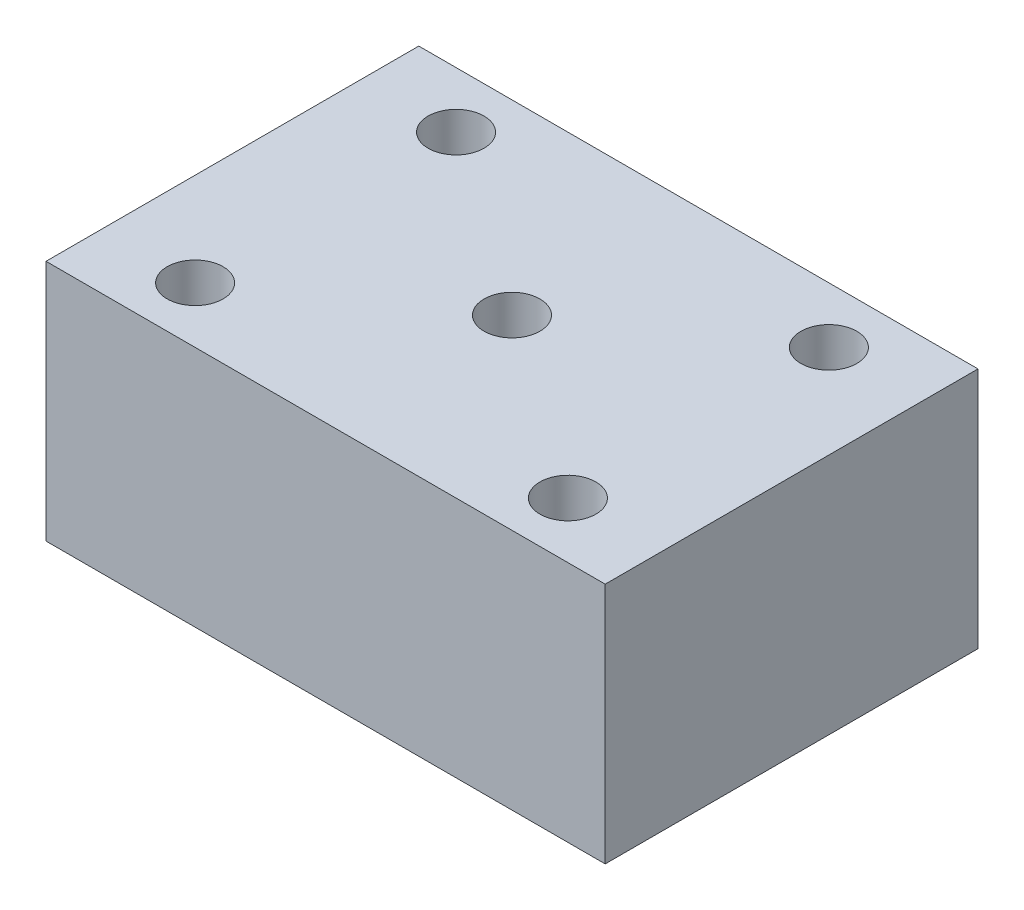
ISO-10303-21;
HEADER;
FILE_DESCRIPTION(('STEP AP214'),'2;1');
FILE_NAME('part.step','',(''),(''),'','','');
FILE_SCHEMA(('AUTOMOTIVE_DESIGN { 1 0 10303 214 1 1 1 1 }'));
ENDSEC;
DATA;
#1=APPLICATION_CONTEXT('core data for automotive mechanical design processes');
#2=APPLICATION_PROTOCOL_DEFINITION('international standard','automotive_design',2000,#1);
#3=PRODUCT_CONTEXT('',#1,'mechanical');
#4=PRODUCT('Part','Part','',(#3));
#5=PRODUCT_RELATED_PRODUCT_CATEGORY('part','',(#4));
#6=PRODUCT_DEFINITION_FORMATION('','',#4);
#7=PRODUCT_DEFINITION_CONTEXT('part definition',#1,'design');
#8=PRODUCT_DEFINITION('design','',#6,#7);
#9=PRODUCT_DEFINITION_SHAPE('','',#8);
#10=(LENGTH_UNIT() NAMED_UNIT(*) SI_UNIT(.MILLI.,.METRE.));
#11=(NAMED_UNIT(*) PLANE_ANGLE_UNIT() SI_UNIT($,.RADIAN.));
#12=(NAMED_UNIT(*) SI_UNIT($,.STERADIAN.) SOLID_ANGLE_UNIT());
#13=UNCERTAINTY_MEASURE_WITH_UNIT(LENGTH_MEASURE(1.E-05),#10,'distance_accuracy_value','');
#14=(GEOMETRIC_REPRESENTATION_CONTEXT(3) GLOBAL_UNCERTAINTY_ASSIGNED_CONTEXT((#13)) GLOBAL_UNIT_ASSIGNED_CONTEXT((#10,
#11,#12)) REPRESENTATION_CONTEXT('',''));
#15=CARTESIAN_POINT('',(0.,0.,0.));
#16=DIRECTION('',(0.,0.,1.));
#17=DIRECTION('',(1.,0.,0.));
#18=AXIS2_PLACEMENT_3D('',#15,#16,#17);
#19=CARTESIAN_POINT('',(0.,13.,0.));
#20=DIRECTION('',(0.,1.,0.));
#21=DIRECTION('',(0.,0.,1.));
#22=AXIS2_PLACEMENT_3D('',#19,#20,#21);
#23=PLANE('',#22);
#24=CARTESIAN_POINT('',(-10.,13.,-7.));
#25=DIRECTION('',(0.,1.,0.));
#26=DIRECTION('',(0.,0.,-1.));
#27=AXIS2_PLACEMENT_3D('',#24,#25,#26);
#28=CIRCLE('',#27,1.5);
#29=CARTESIAN_POINT('',(-10.,13.,-8.5));
#30=VERTEX_POINT('',#29);
#31=EDGE_CURVE('E131',#30,#30,#28,.T.);
#32=ORIENTED_EDGE('',*,*,#31,.F.);
#33=EDGE_LOOP('',(#32));
#34=FACE_BOUND('',#33,.T.);
#35=CARTESIAN_POINT('',(10.,13.,7.));
#36=DIRECTION('',(0.,1.,0.));
#37=DIRECTION('',(0.,0.,-1.));
#38=AXIS2_PLACEMENT_3D('',#35,#36,#37);
#39=CIRCLE('',#38,1.5);
#40=CARTESIAN_POINT('',(10.,13.,5.5));
#41=VERTEX_POINT('',#40);
#42=EDGE_CURVE('E119',#41,#41,#39,.T.);
#43=ORIENTED_EDGE('',*,*,#42,.F.);
#44=EDGE_LOOP('',(#43));
#45=FACE_BOUND('',#44,.T.);
#46=DIRECTION('',(0.,0.,1.));
#47=VECTOR('',#46,1.);
#48=CARTESIAN_POINT('',(-15.,13.,-10.));
#49=LINE('',#48,#47);
#50=CARTESIAN_POINT('',(-15.,13.,-10.));
#51=VERTEX_POINT('',#50);
#52=CARTESIAN_POINT('',(-15.,13.,10.));
#53=VERTEX_POINT('',#52);
#54=EDGE_CURVE('E89',#51,#53,#49,.T.);
#55=ORIENTED_EDGE('',*,*,#54,.T.);
#56=DIRECTION('',(1.,0.,0.));
#57=VECTOR('',#56,1.);
#58=CARTESIAN_POINT('',(-15.,13.,10.));
#59=LINE('',#58,#57);
#60=CARTESIAN_POINT('',(15.,13.,10.));
#61=VERTEX_POINT('',#60);
#62=EDGE_CURVE('E84',#53,#61,#59,.T.);
#63=ORIENTED_EDGE('',*,*,#62,.T.);
#64=DIRECTION('',(0.,0.,-1.));
#65=VECTOR('',#64,1.);
#66=CARTESIAN_POINT('',(15.,13.,-10.));
#67=LINE('',#66,#65);
#68=CARTESIAN_POINT('',(15.,13.,-10.));
#69=VERTEX_POINT('',#68);
#70=EDGE_CURVE('E87',#61,#69,#67,.T.);
#71=ORIENTED_EDGE('',*,*,#70,.T.);
#72=DIRECTION('',(-1.,0.,0.));
#73=VECTOR('',#72,1.);
#74=CARTESIAN_POINT('',(-15.,13.,-10.));
#75=LINE('',#74,#73);
#76=EDGE_CURVE('E54',#69,#51,#75,.T.);
#77=ORIENTED_EDGE('',*,*,#76,.T.);
#78=EDGE_LOOP('',(#55,#63,#71,#77));
#79=FACE_BOUND('',#78,.T.);
#80=CARTESIAN_POINT('',(-10.,13.,7.));
#81=DIRECTION('',(0.,1.,0.));
#82=DIRECTION('',(0.,0.,1.));
#83=AXIS2_PLACEMENT_3D('',#80,#81,#82);
#84=CIRCLE('',#83,1.5);
#85=CARTESIAN_POINT('',(-10.,13.,5.5));
#86=VERTEX_POINT('',#85);
#87=EDGE_CURVE('E104',#86,#86,#84,.T.);
#88=ORIENTED_EDGE('',*,*,#87,.F.);
#89=EDGE_LOOP('',(#88));
#90=FACE_BOUND('',#89,.T.);
#91=CARTESIAN_POINT('',(10.,13.,-7.));
#92=DIRECTION('',(0.,1.,0.));
#93=DIRECTION('',(0.,0.,1.));
#94=AXIS2_PLACEMENT_3D('',#91,#92,#93);
#95=CIRCLE('',#94,1.5);
#96=CARTESIAN_POINT('',(10.,13.,-8.5));
#97=VERTEX_POINT('',#96);
#98=EDGE_CURVE('E125',#97,#97,#95,.T.);
#99=ORIENTED_EDGE('',*,*,#98,.F.);
#100=EDGE_LOOP('',(#99));
#101=FACE_BOUND('',#100,.T.);
#102=CARTESIAN_POINT('',(0.,13.,0.));
#103=DIRECTION('',(0.,1.,0.));
#104=DIRECTION('',(0.,0.,1.));
#105=AXIS2_PLACEMENT_3D('',#102,#103,#104);
#106=CIRCLE('',#105,1.5);
#107=CARTESIAN_POINT('',(0.,13.,-1.5));
#108=VERTEX_POINT('',#107);
#109=EDGE_CURVE('E137',#108,#108,#106,.T.);
#110=ORIENTED_EDGE('',*,*,#109,.F.);
#111=EDGE_LOOP('',(#110));
#112=FACE_BOUND('',#111,.T.);
#113=ADVANCED_FACE('F37',(#34,#45,#79,#90,#101,#112),#23,.T.);
#114=CARTESIAN_POINT('',(0.,0.,0.));
#115=DIRECTION('',(0.,1.,0.));
#116=DIRECTION('',(0.,0.,1.));
#117=AXIS2_PLACEMENT_3D('',#114,#115,#116);
#118=PLANE('',#117);
#119=DIRECTION('',(0.,0.,1.));
#120=VECTOR('',#119,1.);
#121=CARTESIAN_POINT('',(-15.,0.,-10.));
#122=LINE('',#121,#120);
#123=CARTESIAN_POINT('',(-15.,0.,-10.));
#124=VERTEX_POINT('',#123);
#125=CARTESIAN_POINT('',(-15.,0.,10.));
#126=VERTEX_POINT('',#125);
#127=EDGE_CURVE('E101',#124,#126,#122,.T.);
#128=ORIENTED_EDGE('',*,*,#127,.F.);
#129=DIRECTION('',(-1.,0.,0.));
#130=VECTOR('',#129,1.);
#131=CARTESIAN_POINT('',(-15.,0.,-10.));
#132=LINE('',#131,#130);
#133=CARTESIAN_POINT('',(15.,0.,-10.));
#134=VERTEX_POINT('',#133);
#135=EDGE_CURVE('E77',#134,#124,#132,.T.);
#136=ORIENTED_EDGE('',*,*,#135,.F.);
#137=DIRECTION('',(0.,0.,-1.));
#138=VECTOR('',#137,1.);
#139=CARTESIAN_POINT('',(15.,0.,-10.));
#140=LINE('',#139,#138);
#141=CARTESIAN_POINT('',(15.,0.,10.));
#142=VERTEX_POINT('',#141);
#143=EDGE_CURVE('E71',#142,#134,#140,.T.);
#144=ORIENTED_EDGE('',*,*,#143,.F.);
#145=DIRECTION('',(1.,0.,0.));
#146=VECTOR('',#145,1.);
#147=CARTESIAN_POINT('',(-15.,0.,10.));
#148=LINE('',#147,#146);
#149=EDGE_CURVE('E93',#126,#142,#148,.T.);
#150=ORIENTED_EDGE('',*,*,#149,.F.);
#151=EDGE_LOOP('',(#128,#136,#144,#150));
#152=FACE_BOUND('',#151,.T.);
#153=CARTESIAN_POINT('',(-10.,0.,7.));
#154=DIRECTION('',(0.,1.,0.));
#155=DIRECTION('',(0.,0.,1.));
#156=AXIS2_PLACEMENT_3D('',#153,#154,#155);
#157=CIRCLE('',#156,1.5);
#158=CARTESIAN_POINT('',(-10.,0.,5.5));
#159=VERTEX_POINT('',#158);
#160=EDGE_CURVE('E116',#159,#159,#157,.T.);
#161=ORIENTED_EDGE('',*,*,#160,.T.);
#162=EDGE_LOOP('',(#161));
#163=FACE_BOUND('',#162,.T.);
#164=CARTESIAN_POINT('',(10.,0.,7.));
#165=DIRECTION('',(0.,1.,0.));
#166=DIRECTION('',(0.,0.,-1.));
#167=AXIS2_PLACEMENT_3D('',#164,#165,#166);
#168=CIRCLE('',#167,1.5);
#169=CARTESIAN_POINT('',(10.,0.,5.5));
#170=VERTEX_POINT('',#169);
#171=EDGE_CURVE('E122',#170,#170,#168,.T.);
#172=ORIENTED_EDGE('',*,*,#171,.T.);
#173=EDGE_LOOP('',(#172));
#174=FACE_BOUND('',#173,.T.);
#175=CARTESIAN_POINT('',(10.,0.,-7.));
#176=DIRECTION('',(0.,1.,0.));
#177=DIRECTION('',(0.,0.,1.));
#178=AXIS2_PLACEMENT_3D('',#175,#176,#177);
#179=CIRCLE('',#178,1.5);
#180=CARTESIAN_POINT('',(10.,0.,-8.5));
#181=VERTEX_POINT('',#180);
#182=EDGE_CURVE('E128',#181,#181,#179,.T.);
#183=ORIENTED_EDGE('',*,*,#182,.T.);
#184=EDGE_LOOP('',(#183));
#185=FACE_BOUND('',#184,.T.);
#186=CARTESIAN_POINT('',(-10.,0.,-7.));
#187=DIRECTION('',(0.,1.,0.));
#188=DIRECTION('',(0.,0.,-1.));
#189=AXIS2_PLACEMENT_3D('',#186,#187,#188);
#190=CIRCLE('',#189,1.5);
#191=CARTESIAN_POINT('',(-10.,0.,-8.5));
#192=VERTEX_POINT('',#191);
#193=EDGE_CURVE('E134',#192,#192,#190,.T.);
#194=ORIENTED_EDGE('',*,*,#193,.T.);
#195=EDGE_LOOP('',(#194));
#196=FACE_BOUND('',#195,.T.);
#197=CARTESIAN_POINT('',(0.,0.,0.));
#198=DIRECTION('',(0.,1.,0.));
#199=DIRECTION('',(0.,0.,1.));
#200=AXIS2_PLACEMENT_3D('',#197,#198,#199);
#201=CIRCLE('',#200,1.5);
#202=CARTESIAN_POINT('',(0.,0.,-1.5));
#203=VERTEX_POINT('',#202);
#204=EDGE_CURVE('E140',#203,#203,#201,.T.);
#205=ORIENTED_EDGE('',*,*,#204,.T.);
#206=EDGE_LOOP('',(#205));
#207=FACE_BOUND('',#206,.T.);
#208=ADVANCED_FACE('F112',(#152,#163,#174,#185,#196,#207),#118,.F.);
#209=CARTESIAN_POINT('',(-15.,13.,-10.));
#210=DIRECTION('',(1.,0.,0.));
#211=DIRECTION('',(0.,0.,-1.));
#212=AXIS2_PLACEMENT_3D('',#209,#210,#211);
#213=PLANE('',#212);
#214=ORIENTED_EDGE('',*,*,#127,.T.);
#215=DIRECTION('',(0.,-1.,0.));
#216=VECTOR('',#215,1.);
#217=CARTESIAN_POINT('',(-15.,13.,10.));
#218=LINE('',#217,#216);
#219=EDGE_CURVE('E11',#53,#126,#218,.T.);
#220=ORIENTED_EDGE('',*,*,#219,.F.);
#221=ORIENTED_EDGE('',*,*,#54,.F.);
#222=DIRECTION('',(0.,-1.,0.));
#223=VECTOR('',#222,1.);
#224=CARTESIAN_POINT('',(-15.,13.,-10.));
#225=LINE('',#224,#223);
#226=EDGE_CURVE('E97',#51,#124,#225,.T.);
#227=ORIENTED_EDGE('',*,*,#226,.T.);
#228=EDGE_LOOP('',(#214,#220,#221,#227));
#229=FACE_BOUND('',#228,.T.);
#230=ADVANCED_FACE('F39',(#229),#213,.F.);
#231=CARTESIAN_POINT('',(-15.,13.,10.));
#232=DIRECTION('',(0.,0.,-1.));
#233=DIRECTION('',(-1.,0.,0.));
#234=AXIS2_PLACEMENT_3D('',#231,#232,#233);
#235=PLANE('',#234);
#236=ORIENTED_EDGE('',*,*,#149,.T.);
#237=DIRECTION('',(0.,-1.,0.));
#238=VECTOR('',#237,1.);
#239=CARTESIAN_POINT('',(15.,13.,10.));
#240=LINE('',#239,#238);
#241=EDGE_CURVE('E46',#61,#142,#240,.T.);
#242=ORIENTED_EDGE('',*,*,#241,.F.);
#243=ORIENTED_EDGE('',*,*,#62,.F.);
#244=ORIENTED_EDGE('',*,*,#219,.T.);
#245=EDGE_LOOP('',(#236,#242,#243,#244));
#246=FACE_BOUND('',#245,.T.);
#247=ADVANCED_FACE('F92',(#246),#235,.F.);
#248=CARTESIAN_POINT('',(15.,13.,-10.));
#249=DIRECTION('',(-1.,0.,0.));
#250=DIRECTION('',(0.,0.,1.));
#251=AXIS2_PLACEMENT_3D('',#248,#249,#250);
#252=PLANE('',#251);
#253=ORIENTED_EDGE('',*,*,#143,.T.);
#254=DIRECTION('',(0.,-1.,0.));
#255=VECTOR('',#254,1.);
#256=CARTESIAN_POINT('',(15.,13.,-10.));
#257=LINE('',#256,#255);
#258=EDGE_CURVE('E94',#69,#134,#257,.T.);
#259=ORIENTED_EDGE('',*,*,#258,.F.);
#260=ORIENTED_EDGE('',*,*,#70,.F.);
#261=ORIENTED_EDGE('',*,*,#241,.T.);
#262=EDGE_LOOP('',(#253,#259,#260,#261));
#263=FACE_BOUND('',#262,.T.);
#264=ADVANCED_FACE('F95',(#263),#252,.F.);
#265=CARTESIAN_POINT('',(-15.,13.,-10.));
#266=DIRECTION('',(0.,0.,1.));
#267=DIRECTION('',(1.,0.,0.));
#268=AXIS2_PLACEMENT_3D('',#265,#266,#267);
#269=PLANE('',#268);
#270=ORIENTED_EDGE('',*,*,#135,.T.);
#271=ORIENTED_EDGE('',*,*,#226,.F.);
#272=ORIENTED_EDGE('',*,*,#76,.F.);
#273=ORIENTED_EDGE('',*,*,#258,.T.);
#274=EDGE_LOOP('',(#270,#271,#272,#273));
#275=FACE_BOUND('',#274,.T.);
#276=ADVANCED_FACE('F109',(#275),#269,.F.);
#277=CARTESIAN_POINT('',(-10.,13.,7.));
#278=DIRECTION('',(0.,-1.,0.));
#279=DIRECTION('',(0.,0.,-1.));
#280=AXIS2_PLACEMENT_3D('',#277,#278,#279);
#281=CYLINDRICAL_SURFACE('',#280,1.5);
#282=CARTESIAN_POINT('',(-10.,13.,5.5));
#283=CARTESIAN_POINT('',(-10.,12.8645833333333,5.5));
#284=CARTESIAN_POINT('',(-10.,12.7291666666667,5.5));
#285=CARTESIAN_POINT('',(-10.,12.4583333333333,5.5));
#286=CARTESIAN_POINT('',(-10.,12.3229166666667,5.5));
#287=CARTESIAN_POINT('',(-10.,12.0520833333333,5.5));
#288=CARTESIAN_POINT('',(-10.,11.9166666666667,5.5));
#289=CARTESIAN_POINT('',(-10.,11.6458333333333,5.5));
#290=CARTESIAN_POINT('',(-10.,11.5104166666667,5.5));
#291=CARTESIAN_POINT('',(-10.,11.2395833333333,5.5));
#292=CARTESIAN_POINT('',(-10.,11.1041666666667,5.5));
#293=CARTESIAN_POINT('',(-10.,10.8333333333333,5.5));
#294=CARTESIAN_POINT('',(-10.,10.6979166666667,5.5));
#295=CARTESIAN_POINT('',(-10.,10.4270833333333,5.5));
#296=CARTESIAN_POINT('',(-10.,10.2916666666667,5.5));
#297=CARTESIAN_POINT('',(-10.,10.0208333333333,5.5));
#298=CARTESIAN_POINT('',(-10.,9.88541666666667,5.5));
#299=CARTESIAN_POINT('',(-10.,9.61458333333333,5.5));
#300=CARTESIAN_POINT('',(-10.,9.47916666666667,5.5));
#301=CARTESIAN_POINT('',(-10.,9.20833333333333,5.5));
#302=CARTESIAN_POINT('',(-10.,9.07291666666666,5.5));
#303=CARTESIAN_POINT('',(-10.,8.80208333333333,5.5));
#304=CARTESIAN_POINT('',(-10.,8.66666666666667,5.5));
#305=CARTESIAN_POINT('',(-10.,8.39583333333333,5.5));
#306=CARTESIAN_POINT('',(-10.,8.26041666666667,5.5));
#307=CARTESIAN_POINT('',(-10.,7.98958333333333,5.5));
#308=CARTESIAN_POINT('',(-10.,7.85416666666667,5.5));
#309=CARTESIAN_POINT('',(-10.,7.58333333333333,5.5));
#310=CARTESIAN_POINT('',(-10.,7.44791666666667,5.5));
#311=CARTESIAN_POINT('',(-10.,7.17708333333333,5.5));
#312=CARTESIAN_POINT('',(-10.,7.04166666666667,5.5));
#313=CARTESIAN_POINT('',(-10.,6.77083333333333,5.5));
#314=CARTESIAN_POINT('',(-10.,6.63541666666667,5.5));
#315=CARTESIAN_POINT('',(-10.,6.36458333333333,5.5));
#316=CARTESIAN_POINT('',(-10.,6.22916666666667,5.5));
#317=CARTESIAN_POINT('',(-10.,5.95833333333333,5.5));
#318=CARTESIAN_POINT('',(-10.,5.82291666666667,5.5));
#319=CARTESIAN_POINT('',(-10.,5.55208333333333,5.5));
#320=CARTESIAN_POINT('',(-10.,5.41666666666667,5.5));
#321=CARTESIAN_POINT('',(-10.,5.14583333333333,5.5));
#322=CARTESIAN_POINT('',(-10.,5.01041666666667,5.5));
#323=CARTESIAN_POINT('',(-10.,4.73958333333333,5.5));
#324=CARTESIAN_POINT('',(-10.,4.60416666666667,5.5));
#325=CARTESIAN_POINT('',(-10.,4.33333333333333,5.5));
#326=CARTESIAN_POINT('',(-10.,4.19791666666667,5.5));
#327=CARTESIAN_POINT('',(-10.,3.92708333333333,5.5));
#328=CARTESIAN_POINT('',(-10.,3.79166666666667,5.5));
#329=CARTESIAN_POINT('',(-10.,3.52083333333333,5.5));
#330=CARTESIAN_POINT('',(-10.,3.38541666666667,5.5));
#331=CARTESIAN_POINT('',(-10.,3.11458333333333,5.5));
#332=CARTESIAN_POINT('',(-10.,2.97916666666667,5.5));
#333=CARTESIAN_POINT('',(-10.,2.70833333333333,5.5));
#334=CARTESIAN_POINT('',(-10.,2.57291666666667,5.5));
#335=CARTESIAN_POINT('',(-10.,2.30208333333333,5.5));
#336=CARTESIAN_POINT('',(-10.,2.16666666666667,5.5));
#337=CARTESIAN_POINT('',(-10.,1.89583333333333,5.5));
#338=CARTESIAN_POINT('',(-10.,1.76041666666667,5.5));
#339=CARTESIAN_POINT('',(-10.,1.48958333333333,5.5));
#340=CARTESIAN_POINT('',(-10.,1.35416666666667,5.5));
#341=CARTESIAN_POINT('',(-10.,1.08333333333333,5.5));
#342=CARTESIAN_POINT('',(-10.,0.947916666666667,5.5));
#343=CARTESIAN_POINT('',(-10.,0.677083333333334,5.5));
#344=CARTESIAN_POINT('',(-10.,0.541666666666667,5.5));
#345=CARTESIAN_POINT('',(-10.,0.270833333333334,5.5));
#346=CARTESIAN_POINT('',(-10.,0.135416666666667,5.5));
#347=CARTESIAN_POINT('',(-10.,0.,5.5));
#348=B_SPLINE_CURVE_WITH_KNOTS('',3,(#282,#283,#284,#285,#286,#287,#288,#289,#290,#291,#292,
#293,#294,#295,#296,#297,#298,#299,#300,#301,#302,#303,#304,#305,#306,#307,#308,#309,#310,#311,
#312,#313,#314,#315,#316,#317,#318,#319,#320,#321,#322,#323,#324,#325,#326,#327,#328,#329,#330,
#331,#332,#333,#334,#335,#336,#337,#338,#339,#340,#341,#342,#343,#344,#345,#346,#347),
.UNSPECIFIED.,.F.,.F.,(4,2,2,2,2,2,2,2,2,2,2,2,2,2,2,2,2,2,2,2,2,2,2,2,2,2,2,2,2,2,2,2,4),(0.,
0.40625,0.812500000000001,1.21875,1.625,2.03125,2.4375,2.84375,3.25,3.65625,4.0625,4.46875,
4.875,5.28125,5.6875,6.09375,6.5,6.90625,7.3125,7.71875,8.125,8.53125,8.9375,9.34375,9.75,
10.15625,10.5625,10.96875,11.375,11.78125,12.1875,12.59375,13.),.UNSPECIFIED.);
#349=EDGE_CURVE('BSEAM159',#86,#159,#348,.T.);
#350=ORIENTED_EDGE('',*,*,#87,.T.);
#351=ORIENTED_EDGE('',*,*,#160,.F.);
#352=ORIENTED_EDGE('',*,*,#349,.T.);
#353=ORIENTED_EDGE('',*,*,#349,.F.);
#354=EDGE_LOOP('',(#350,#352,#351,#353));
#355=FACE_BOUND('',#354,.T.);
#356=ADVANCED_FACE('F159',(#355),#281,.F.);
#357=CARTESIAN_POINT('',(10.,13.,7.));
#358=DIRECTION('',(0.,-1.,0.));
#359=DIRECTION('',(0.,0.,-1.));
#360=AXIS2_PLACEMENT_3D('',#357,#358,#359);
#361=CYLINDRICAL_SURFACE('',#360,1.5);
#362=CARTESIAN_POINT('',(10.,13.,5.5));
#363=CARTESIAN_POINT('',(10.,12.8645833333333,5.5));
#364=CARTESIAN_POINT('',(10.,12.7291666666667,5.5));
#365=CARTESIAN_POINT('',(10.,12.4583333333333,5.5));
#366=CARTESIAN_POINT('',(10.,12.3229166666667,5.5));
#367=CARTESIAN_POINT('',(10.,12.0520833333333,5.5));
#368=CARTESIAN_POINT('',(10.,11.9166666666667,5.5));
#369=CARTESIAN_POINT('',(10.,11.6458333333333,5.5));
#370=CARTESIAN_POINT('',(10.,11.5104166666667,5.5));
#371=CARTESIAN_POINT('',(10.,11.2395833333333,5.5));
#372=CARTESIAN_POINT('',(10.,11.1041666666667,5.5));
#373=CARTESIAN_POINT('',(10.,10.8333333333333,5.5));
#374=CARTESIAN_POINT('',(10.,10.6979166666667,5.5));
#375=CARTESIAN_POINT('',(10.,10.4270833333333,5.5));
#376=CARTESIAN_POINT('',(10.,10.2916666666667,5.5));
#377=CARTESIAN_POINT('',(10.,10.0208333333333,5.5));
#378=CARTESIAN_POINT('',(10.,9.88541666666667,5.5));
#379=CARTESIAN_POINT('',(10.,9.61458333333333,5.5));
#380=CARTESIAN_POINT('',(10.,9.47916666666667,5.5));
#381=CARTESIAN_POINT('',(10.,9.20833333333333,5.5));
#382=CARTESIAN_POINT('',(10.,9.07291666666666,5.5));
#383=CARTESIAN_POINT('',(10.,8.80208333333333,5.5));
#384=CARTESIAN_POINT('',(10.,8.66666666666667,5.5));
#385=CARTESIAN_POINT('',(10.,8.39583333333333,5.5));
#386=CARTESIAN_POINT('',(10.,8.26041666666667,5.5));
#387=CARTESIAN_POINT('',(10.,7.98958333333333,5.5));
#388=CARTESIAN_POINT('',(10.,7.85416666666667,5.5));
#389=CARTESIAN_POINT('',(10.,7.58333333333333,5.5));
#390=CARTESIAN_POINT('',(10.,7.44791666666667,5.5));
#391=CARTESIAN_POINT('',(10.,7.17708333333333,5.5));
#392=CARTESIAN_POINT('',(10.,7.04166666666667,5.5));
#393=CARTESIAN_POINT('',(10.,6.77083333333333,5.5));
#394=CARTESIAN_POINT('',(10.,6.63541666666667,5.5));
#395=CARTESIAN_POINT('',(10.,6.36458333333333,5.5));
#396=CARTESIAN_POINT('',(10.,6.22916666666667,5.5));
#397=CARTESIAN_POINT('',(10.,5.95833333333333,5.5));
#398=CARTESIAN_POINT('',(10.,5.82291666666667,5.5));
#399=CARTESIAN_POINT('',(10.,5.55208333333333,5.5));
#400=CARTESIAN_POINT('',(10.,5.41666666666667,5.5));
#401=CARTESIAN_POINT('',(10.,5.14583333333333,5.5));
#402=CARTESIAN_POINT('',(10.,5.01041666666667,5.5));
#403=CARTESIAN_POINT('',(10.,4.73958333333333,5.5));
#404=CARTESIAN_POINT('',(10.,4.60416666666667,5.5));
#405=CARTESIAN_POINT('',(10.,4.33333333333333,5.5));
#406=CARTESIAN_POINT('',(10.,4.19791666666667,5.5));
#407=CARTESIAN_POINT('',(10.,3.92708333333333,5.5));
#408=CARTESIAN_POINT('',(10.,3.79166666666667,5.5));
#409=CARTESIAN_POINT('',(10.,3.52083333333333,5.5));
#410=CARTESIAN_POINT('',(10.,3.38541666666667,5.5));
#411=CARTESIAN_POINT('',(10.,3.11458333333333,5.5));
#412=CARTESIAN_POINT('',(10.,2.97916666666667,5.5));
#413=CARTESIAN_POINT('',(10.,2.70833333333333,5.5));
#414=CARTESIAN_POINT('',(10.,2.57291666666667,5.5));
#415=CARTESIAN_POINT('',(10.,2.30208333333333,5.5));
#416=CARTESIAN_POINT('',(10.,2.16666666666667,5.5));
#417=CARTESIAN_POINT('',(10.,1.89583333333333,5.5));
#418=CARTESIAN_POINT('',(10.,1.76041666666667,5.5));
#419=CARTESIAN_POINT('',(10.,1.48958333333333,5.5));
#420=CARTESIAN_POINT('',(10.,1.35416666666667,5.5));
#421=CARTESIAN_POINT('',(10.,1.08333333333333,5.5));
#422=CARTESIAN_POINT('',(10.,0.947916666666667,5.5));
#423=CARTESIAN_POINT('',(10.,0.677083333333334,5.5));
#424=CARTESIAN_POINT('',(10.,0.541666666666667,5.5));
#425=CARTESIAN_POINT('',(10.,0.270833333333334,5.5));
#426=CARTESIAN_POINT('',(10.,0.135416666666667,5.5));
#427=CARTESIAN_POINT('',(10.,0.,5.5));
#428=B_SPLINE_CURVE_WITH_KNOTS('',3,(#362,#363,#364,#365,#366,#367,#368,#369,#370,#371,#372,
#373,#374,#375,#376,#377,#378,#379,#380,#381,#382,#383,#384,#385,#386,#387,#388,#389,#390,#391,
#392,#393,#394,#395,#396,#397,#398,#399,#400,#401,#402,#403,#404,#405,#406,#407,#408,#409,#410,
#411,#412,#413,#414,#415,#416,#417,#418,#419,#420,#421,#422,#423,#424,#425,#426,#427),
.UNSPECIFIED.,.F.,.F.,(4,2,2,2,2,2,2,2,2,2,2,2,2,2,2,2,2,2,2,2,2,2,2,2,2,2,2,2,2,2,2,2,4),(0.,
0.40625,0.812500000000001,1.21875,1.625,2.03125,2.4375,2.84375,3.25,3.65625,4.0625,4.46875,
4.875,5.28125,5.6875,6.09375,6.5,6.90625,7.3125,7.71875,8.125,8.53125,8.9375,9.34375,9.75,
10.15625,10.5625,10.96875,11.375,11.78125,12.1875,12.59375,13.),.UNSPECIFIED.);
#429=EDGE_CURVE('BSEAM205',#41,#170,#428,.T.);
#430=ORIENTED_EDGE('',*,*,#42,.T.);
#431=ORIENTED_EDGE('',*,*,#171,.F.);
#432=ORIENTED_EDGE('',*,*,#429,.T.);
#433=ORIENTED_EDGE('',*,*,#429,.F.);
#434=EDGE_LOOP('',(#430,#432,#431,#433));
#435=FACE_BOUND('',#434,.T.);
#436=ADVANCED_FACE('F205',(#435),#361,.F.);
#437=CARTESIAN_POINT('',(10.,13.,-7.));
#438=DIRECTION('',(0.,-1.,0.));
#439=DIRECTION('',(0.,0.,-1.));
#440=AXIS2_PLACEMENT_3D('',#437,#438,#439);
#441=CYLINDRICAL_SURFACE('',#440,1.5);
#442=CARTESIAN_POINT('',(10.,13.,-8.5));
#443=CARTESIAN_POINT('',(10.,12.8645833333333,-8.5));
#444=CARTESIAN_POINT('',(10.,12.7291666666667,-8.5));
#445=CARTESIAN_POINT('',(10.,12.4583333333333,-8.5));
#446=CARTESIAN_POINT('',(10.,12.3229166666667,-8.5));
#447=CARTESIAN_POINT('',(10.,12.0520833333333,-8.5));
#448=CARTESIAN_POINT('',(10.,11.9166666666667,-8.5));
#449=CARTESIAN_POINT('',(10.,11.6458333333333,-8.5));
#450=CARTESIAN_POINT('',(10.,11.5104166666667,-8.5));
#451=CARTESIAN_POINT('',(10.,11.2395833333333,-8.5));
#452=CARTESIAN_POINT('',(10.,11.1041666666667,-8.5));
#453=CARTESIAN_POINT('',(10.,10.8333333333333,-8.5));
#454=CARTESIAN_POINT('',(10.,10.6979166666667,-8.5));
#455=CARTESIAN_POINT('',(10.,10.4270833333333,-8.5));
#456=CARTESIAN_POINT('',(10.,10.2916666666667,-8.5));
#457=CARTESIAN_POINT('',(10.,10.0208333333333,-8.5));
#458=CARTESIAN_POINT('',(10.,9.88541666666667,-8.5));
#459=CARTESIAN_POINT('',(10.,9.61458333333333,-8.5));
#460=CARTESIAN_POINT('',(10.,9.47916666666667,-8.5));
#461=CARTESIAN_POINT('',(10.,9.20833333333333,-8.5));
#462=CARTESIAN_POINT('',(10.,9.07291666666666,-8.5));
#463=CARTESIAN_POINT('',(10.,8.80208333333333,-8.5));
#464=CARTESIAN_POINT('',(10.,8.66666666666667,-8.5));
#465=CARTESIAN_POINT('',(10.,8.39583333333333,-8.5));
#466=CARTESIAN_POINT('',(10.,8.26041666666667,-8.5));
#467=CARTESIAN_POINT('',(10.,7.98958333333333,-8.5));
#468=CARTESIAN_POINT('',(10.,7.85416666666667,-8.5));
#469=CARTESIAN_POINT('',(10.,7.58333333333333,-8.5));
#470=CARTESIAN_POINT('',(10.,7.44791666666667,-8.5));
#471=CARTESIAN_POINT('',(10.,7.17708333333333,-8.5));
#472=CARTESIAN_POINT('',(10.,7.04166666666667,-8.5));
#473=CARTESIAN_POINT('',(10.,6.77083333333333,-8.5));
#474=CARTESIAN_POINT('',(10.,6.63541666666667,-8.5));
#475=CARTESIAN_POINT('',(10.,6.36458333333333,-8.5));
#476=CARTESIAN_POINT('',(10.,6.22916666666667,-8.5));
#477=CARTESIAN_POINT('',(10.,5.95833333333333,-8.5));
#478=CARTESIAN_POINT('',(10.,5.82291666666667,-8.5));
#479=CARTESIAN_POINT('',(10.,5.55208333333333,-8.5));
#480=CARTESIAN_POINT('',(10.,5.41666666666667,-8.5));
#481=CARTESIAN_POINT('',(10.,5.14583333333333,-8.5));
#482=CARTESIAN_POINT('',(10.,5.01041666666667,-8.5));
#483=CARTESIAN_POINT('',(10.,4.73958333333333,-8.5));
#484=CARTESIAN_POINT('',(10.,4.60416666666667,-8.5));
#485=CARTESIAN_POINT('',(10.,4.33333333333333,-8.5));
#486=CARTESIAN_POINT('',(10.,4.19791666666667,-8.5));
#487=CARTESIAN_POINT('',(10.,3.92708333333333,-8.5));
#488=CARTESIAN_POINT('',(10.,3.79166666666667,-8.5));
#489=CARTESIAN_POINT('',(10.,3.52083333333333,-8.5));
#490=CARTESIAN_POINT('',(10.,3.38541666666667,-8.5));
#491=CARTESIAN_POINT('',(10.,3.11458333333333,-8.5));
#492=CARTESIAN_POINT('',(10.,2.97916666666667,-8.5));
#493=CARTESIAN_POINT('',(10.,2.70833333333333,-8.5));
#494=CARTESIAN_POINT('',(10.,2.57291666666667,-8.5));
#495=CARTESIAN_POINT('',(10.,2.30208333333333,-8.5));
#496=CARTESIAN_POINT('',(10.,2.16666666666667,-8.5));
#497=CARTESIAN_POINT('',(10.,1.89583333333333,-8.5));
#498=CARTESIAN_POINT('',(10.,1.76041666666667,-8.5));
#499=CARTESIAN_POINT('',(10.,1.48958333333333,-8.5));
#500=CARTESIAN_POINT('',(10.,1.35416666666667,-8.5));
#501=CARTESIAN_POINT('',(10.,1.08333333333333,-8.5));
#502=CARTESIAN_POINT('',(10.,0.947916666666667,-8.5));
#503=CARTESIAN_POINT('',(10.,0.677083333333334,-8.5));
#504=CARTESIAN_POINT('',(10.,0.541666666666667,-8.5));
#505=CARTESIAN_POINT('',(10.,0.270833333333334,-8.5));
#506=CARTESIAN_POINT('',(10.,0.135416666666667,-8.5));
#507=CARTESIAN_POINT('',(10.,0.,-8.5));
#508=B_SPLINE_CURVE_WITH_KNOTS('',3,(#442,#443,#444,#445,#446,#447,#448,#449,#450,#451,#452,
#453,#454,#455,#456,#457,#458,#459,#460,#461,#462,#463,#464,#465,#466,#467,#468,#469,#470,#471,
#472,#473,#474,#475,#476,#477,#478,#479,#480,#481,#482,#483,#484,#485,#486,#487,#488,#489,#490,
#491,#492,#493,#494,#495,#496,#497,#498,#499,#500,#501,#502,#503,#504,#505,#506,#507),
.UNSPECIFIED.,.F.,.F.,(4,2,2,2,2,2,2,2,2,2,2,2,2,2,2,2,2,2,2,2,2,2,2,2,2,2,2,2,2,2,2,2,4),(0.,
0.40625,0.812500000000001,1.21875,1.625,2.03125,2.4375,2.84375,3.25,3.65625,4.0625,4.46875,
4.875,5.28125,5.6875,6.09375,6.5,6.90625,7.3125,7.71875,8.125,8.53125,8.9375,9.34375,9.75,
10.15625,10.5625,10.96875,11.375,11.78125,12.1875,12.59375,13.),.UNSPECIFIED.);
#509=EDGE_CURVE('BSEAM213',#97,#181,#508,.T.);
#510=ORIENTED_EDGE('',*,*,#98,.T.);
#511=ORIENTED_EDGE('',*,*,#182,.F.);
#512=ORIENTED_EDGE('',*,*,#509,.T.);
#513=ORIENTED_EDGE('',*,*,#509,.F.);
#514=EDGE_LOOP('',(#510,#512,#511,#513));
#515=FACE_BOUND('',#514,.T.);
#516=ADVANCED_FACE('F213',(#515),#441,.F.);
#517=CARTESIAN_POINT('',(-10.,13.,-7.));
#518=DIRECTION('',(0.,-1.,0.));
#519=DIRECTION('',(0.,0.,-1.));
#520=AXIS2_PLACEMENT_3D('',#517,#518,#519);
#521=CYLINDRICAL_SURFACE('',#520,1.5);
#522=CARTESIAN_POINT('',(-10.,13.,-8.5));
#523=CARTESIAN_POINT('',(-10.,12.8645833333333,-8.5));
#524=CARTESIAN_POINT('',(-10.,12.7291666666667,-8.5));
#525=CARTESIAN_POINT('',(-10.,12.4583333333333,-8.5));
#526=CARTESIAN_POINT('',(-10.,12.3229166666667,-8.5));
#527=CARTESIAN_POINT('',(-10.,12.0520833333333,-8.5));
#528=CARTESIAN_POINT('',(-10.,11.9166666666667,-8.5));
#529=CARTESIAN_POINT('',(-10.,11.6458333333333,-8.5));
#530=CARTESIAN_POINT('',(-10.,11.5104166666667,-8.5));
#531=CARTESIAN_POINT('',(-10.,11.2395833333333,-8.5));
#532=CARTESIAN_POINT('',(-10.,11.1041666666667,-8.5));
#533=CARTESIAN_POINT('',(-10.,10.8333333333333,-8.5));
#534=CARTESIAN_POINT('',(-10.,10.6979166666667,-8.5));
#535=CARTESIAN_POINT('',(-10.,10.4270833333333,-8.5));
#536=CARTESIAN_POINT('',(-10.,10.2916666666667,-8.5));
#537=CARTESIAN_POINT('',(-10.,10.0208333333333,-8.5));
#538=CARTESIAN_POINT('',(-10.,9.88541666666667,-8.5));
#539=CARTESIAN_POINT('',(-10.,9.61458333333333,-8.5));
#540=CARTESIAN_POINT('',(-10.,9.47916666666667,-8.5));
#541=CARTESIAN_POINT('',(-10.,9.20833333333333,-8.5));
#542=CARTESIAN_POINT('',(-10.,9.07291666666666,-8.5));
#543=CARTESIAN_POINT('',(-10.,8.80208333333333,-8.5));
#544=CARTESIAN_POINT('',(-10.,8.66666666666667,-8.5));
#545=CARTESIAN_POINT('',(-10.,8.39583333333333,-8.5));
#546=CARTESIAN_POINT('',(-10.,8.26041666666667,-8.5));
#547=CARTESIAN_POINT('',(-10.,7.98958333333333,-8.5));
#548=CARTESIAN_POINT('',(-10.,7.85416666666667,-8.5));
#549=CARTESIAN_POINT('',(-10.,7.58333333333333,-8.5));
#550=CARTESIAN_POINT('',(-10.,7.44791666666667,-8.5));
#551=CARTESIAN_POINT('',(-10.,7.17708333333333,-8.5));
#552=CARTESIAN_POINT('',(-10.,7.04166666666667,-8.5));
#553=CARTESIAN_POINT('',(-10.,6.77083333333333,-8.5));
#554=CARTESIAN_POINT('',(-10.,6.63541666666667,-8.5));
#555=CARTESIAN_POINT('',(-10.,6.36458333333333,-8.5));
#556=CARTESIAN_POINT('',(-10.,6.22916666666667,-8.5));
#557=CARTESIAN_POINT('',(-10.,5.95833333333333,-8.5));
#558=CARTESIAN_POINT('',(-10.,5.82291666666667,-8.5));
#559=CARTESIAN_POINT('',(-10.,5.55208333333333,-8.5));
#560=CARTESIAN_POINT('',(-10.,5.41666666666667,-8.5));
#561=CARTESIAN_POINT('',(-10.,5.14583333333333,-8.5));
#562=CARTESIAN_POINT('',(-10.,5.01041666666667,-8.5));
#563=CARTESIAN_POINT('',(-10.,4.73958333333333,-8.5));
#564=CARTESIAN_POINT('',(-10.,4.60416666666667,-8.5));
#565=CARTESIAN_POINT('',(-10.,4.33333333333333,-8.5));
#566=CARTESIAN_POINT('',(-10.,4.19791666666667,-8.5));
#567=CARTESIAN_POINT('',(-10.,3.92708333333333,-8.5));
#568=CARTESIAN_POINT('',(-10.,3.79166666666667,-8.5));
#569=CARTESIAN_POINT('',(-10.,3.52083333333333,-8.5));
#570=CARTESIAN_POINT('',(-10.,3.38541666666667,-8.5));
#571=CARTESIAN_POINT('',(-10.,3.11458333333333,-8.5));
#572=CARTESIAN_POINT('',(-10.,2.97916666666667,-8.5));
#573=CARTESIAN_POINT('',(-10.,2.70833333333333,-8.5));
#574=CARTESIAN_POINT('',(-10.,2.57291666666667,-8.5));
#575=CARTESIAN_POINT('',(-10.,2.30208333333333,-8.5));
#576=CARTESIAN_POINT('',(-10.,2.16666666666667,-8.5));
#577=CARTESIAN_POINT('',(-10.,1.89583333333333,-8.5));
#578=CARTESIAN_POINT('',(-10.,1.76041666666667,-8.5));
#579=CARTESIAN_POINT('',(-10.,1.48958333333333,-8.5));
#580=CARTESIAN_POINT('',(-10.,1.35416666666667,-8.5));
#581=CARTESIAN_POINT('',(-10.,1.08333333333333,-8.5));
#582=CARTESIAN_POINT('',(-10.,0.947916666666667,-8.5));
#583=CARTESIAN_POINT('',(-10.,0.677083333333334,-8.5));
#584=CARTESIAN_POINT('',(-10.,0.541666666666667,-8.5));
#585=CARTESIAN_POINT('',(-10.,0.270833333333334,-8.5));
#586=CARTESIAN_POINT('',(-10.,0.135416666666667,-8.5));
#587=CARTESIAN_POINT('',(-10.,0.,-8.5));
#588=B_SPLINE_CURVE_WITH_KNOTS('',3,(#522,#523,#524,#525,#526,#527,#528,#529,#530,#531,#532,
#533,#534,#535,#536,#537,#538,#539,#540,#541,#542,#543,#544,#545,#546,#547,#548,#549,#550,#551,
#552,#553,#554,#555,#556,#557,#558,#559,#560,#561,#562,#563,#564,#565,#566,#567,#568,#569,#570,
#571,#572,#573,#574,#575,#576,#577,#578,#579,#580,#581,#582,#583,#584,#585,#586,#587),
.UNSPECIFIED.,.F.,.F.,(4,2,2,2,2,2,2,2,2,2,2,2,2,2,2,2,2,2,2,2,2,2,2,2,2,2,2,2,2,2,2,2,4),(0.,
0.40625,0.812500000000001,1.21875,1.625,2.03125,2.4375,2.84375,3.25,3.65625,4.0625,4.46875,
4.875,5.28125,5.6875,6.09375,6.5,6.90625,7.3125,7.71875,8.125,8.53125,8.9375,9.34375,9.75,
10.15625,10.5625,10.96875,11.375,11.78125,12.1875,12.59375,13.),.UNSPECIFIED.);
#589=EDGE_CURVE('BSEAM221',#30,#192,#588,.T.);
#590=ORIENTED_EDGE('',*,*,#31,.T.);
#591=ORIENTED_EDGE('',*,*,#193,.F.);
#592=ORIENTED_EDGE('',*,*,#589,.T.);
#593=ORIENTED_EDGE('',*,*,#589,.F.);
#594=EDGE_LOOP('',(#590,#592,#591,#593));
#595=FACE_BOUND('',#594,.T.);
#596=ADVANCED_FACE('F221',(#595),#521,.F.);
#597=CARTESIAN_POINT('',(0.,13.,0.));
#598=DIRECTION('',(0.,-1.,0.));
#599=DIRECTION('',(0.,0.,-1.));
#600=AXIS2_PLACEMENT_3D('',#597,#598,#599);
#601=CYLINDRICAL_SURFACE('',#600,1.5);
#602=CARTESIAN_POINT('',(0.,13.,-1.5));
#603=CARTESIAN_POINT('',(0.,12.8645833333333,-1.5));
#604=CARTESIAN_POINT('',(0.,12.7291666666667,-1.5));
#605=CARTESIAN_POINT('',(0.,12.4583333333333,-1.5));
#606=CARTESIAN_POINT('',(0.,12.3229166666667,-1.5));
#607=CARTESIAN_POINT('',(0.,12.0520833333333,-1.5));
#608=CARTESIAN_POINT('',(0.,11.9166666666667,-1.5));
#609=CARTESIAN_POINT('',(0.,11.6458333333333,-1.5));
#610=CARTESIAN_POINT('',(0.,11.5104166666667,-1.5));
#611=CARTESIAN_POINT('',(0.,11.2395833333333,-1.5));
#612=CARTESIAN_POINT('',(0.,11.1041666666667,-1.5));
#613=CARTESIAN_POINT('',(0.,10.8333333333333,-1.5));
#614=CARTESIAN_POINT('',(0.,10.6979166666667,-1.5));
#615=CARTESIAN_POINT('',(0.,10.4270833333333,-1.5));
#616=CARTESIAN_POINT('',(0.,10.2916666666667,-1.5));
#617=CARTESIAN_POINT('',(0.,10.0208333333333,-1.5));
#618=CARTESIAN_POINT('',(0.,9.88541666666667,-1.5));
#619=CARTESIAN_POINT('',(0.,9.61458333333333,-1.5));
#620=CARTESIAN_POINT('',(0.,9.47916666666667,-1.5));
#621=CARTESIAN_POINT('',(0.,9.20833333333333,-1.5));
#622=CARTESIAN_POINT('',(0.,9.07291666666666,-1.5));
#623=CARTESIAN_POINT('',(0.,8.80208333333333,-1.5));
#624=CARTESIAN_POINT('',(0.,8.66666666666667,-1.5));
#625=CARTESIAN_POINT('',(0.,8.39583333333333,-1.5));
#626=CARTESIAN_POINT('',(0.,8.26041666666667,-1.5));
#627=CARTESIAN_POINT('',(0.,7.98958333333333,-1.5));
#628=CARTESIAN_POINT('',(0.,7.85416666666667,-1.5));
#629=CARTESIAN_POINT('',(0.,7.58333333333333,-1.5));
#630=CARTESIAN_POINT('',(0.,7.44791666666667,-1.5));
#631=CARTESIAN_POINT('',(0.,7.17708333333333,-1.5));
#632=CARTESIAN_POINT('',(0.,7.04166666666667,-1.5));
#633=CARTESIAN_POINT('',(0.,6.77083333333333,-1.5));
#634=CARTESIAN_POINT('',(0.,6.63541666666667,-1.5));
#635=CARTESIAN_POINT('',(0.,6.36458333333333,-1.5));
#636=CARTESIAN_POINT('',(0.,6.22916666666667,-1.5));
#637=CARTESIAN_POINT('',(0.,5.95833333333333,-1.5));
#638=CARTESIAN_POINT('',(0.,5.82291666666667,-1.5));
#639=CARTESIAN_POINT('',(0.,5.55208333333333,-1.5));
#640=CARTESIAN_POINT('',(0.,5.41666666666667,-1.5));
#641=CARTESIAN_POINT('',(0.,5.14583333333333,-1.5));
#642=CARTESIAN_POINT('',(0.,5.01041666666667,-1.5));
#643=CARTESIAN_POINT('',(0.,4.73958333333333,-1.5));
#644=CARTESIAN_POINT('',(0.,4.60416666666667,-1.5));
#645=CARTESIAN_POINT('',(0.,4.33333333333333,-1.5));
#646=CARTESIAN_POINT('',(0.,4.19791666666667,-1.5));
#647=CARTESIAN_POINT('',(0.,3.92708333333333,-1.5));
#648=CARTESIAN_POINT('',(0.,3.79166666666667,-1.5));
#649=CARTESIAN_POINT('',(0.,3.52083333333333,-1.5));
#650=CARTESIAN_POINT('',(0.,3.38541666666667,-1.5));
#651=CARTESIAN_POINT('',(0.,3.11458333333333,-1.5));
#652=CARTESIAN_POINT('',(0.,2.97916666666667,-1.5));
#653=CARTESIAN_POINT('',(0.,2.70833333333333,-1.5));
#654=CARTESIAN_POINT('',(0.,2.57291666666667,-1.5));
#655=CARTESIAN_POINT('',(0.,2.30208333333333,-1.5));
#656=CARTESIAN_POINT('',(0.,2.16666666666667,-1.5));
#657=CARTESIAN_POINT('',(0.,1.89583333333333,-1.5));
#658=CARTESIAN_POINT('',(0.,1.76041666666667,-1.5));
#659=CARTESIAN_POINT('',(0.,1.48958333333333,-1.5));
#660=CARTESIAN_POINT('',(0.,1.35416666666667,-1.5));
#661=CARTESIAN_POINT('',(0.,1.08333333333333,-1.5));
#662=CARTESIAN_POINT('',(0.,0.947916666666667,-1.5));
#663=CARTESIAN_POINT('',(0.,0.677083333333334,-1.5));
#664=CARTESIAN_POINT('',(0.,0.541666666666667,-1.5));
#665=CARTESIAN_POINT('',(0.,0.270833333333334,-1.5));
#666=CARTESIAN_POINT('',(0.,0.135416666666667,-1.5));
#667=CARTESIAN_POINT('',(0.,0.,-1.5));
#668=B_SPLINE_CURVE_WITH_KNOTS('',3,(#602,#603,#604,#605,#606,#607,#608,#609,#610,#611,#612,
#613,#614,#615,#616,#617,#618,#619,#620,#621,#622,#623,#624,#625,#626,#627,#628,#629,#630,#631,
#632,#633,#634,#635,#636,#637,#638,#639,#640,#641,#642,#643,#644,#645,#646,#647,#648,#649,#650,
#651,#652,#653,#654,#655,#656,#657,#658,#659,#660,#661,#662,#663,#664,#665,#666,#667),
.UNSPECIFIED.,.F.,.F.,(4,2,2,2,2,2,2,2,2,2,2,2,2,2,2,2,2,2,2,2,2,2,2,2,2,2,2,2,2,2,2,2,4),(0.,
0.40625,0.812500000000001,1.21875,1.625,2.03125,2.4375,2.84375,3.25,3.65625,4.0625,4.46875,
4.875,5.28125,5.6875,6.09375,6.5,6.90625,7.3125,7.71875,8.125,8.53125,8.9375,9.34375,9.75,
10.15625,10.5625,10.96875,11.375,11.78125,12.1875,12.59375,13.),.UNSPECIFIED.);
#669=EDGE_CURVE('BSEAM146',#108,#203,#668,.T.);
#670=ORIENTED_EDGE('',*,*,#109,.T.);
#671=ORIENTED_EDGE('',*,*,#204,.F.);
#672=ORIENTED_EDGE('',*,*,#669,.T.);
#673=ORIENTED_EDGE('',*,*,#669,.F.);
#674=EDGE_LOOP('',(#670,#672,#671,#673));
#675=FACE_BOUND('',#674,.T.);
#676=ADVANCED_FACE('F146',(#675),#601,.F.);
#677=CLOSED_SHELL('',(#113,#208,#230,#247,#264,#276,#356,#436,#516,#596,#676));
#678=MANIFOLD_SOLID_BREP('B2',#677);
#679=ADVANCED_BREP_SHAPE_REPRESENTATION('',(#18,#678),#14);
#680=SHAPE_DEFINITION_REPRESENTATION(#9,#679);
ENDSEC;
END-ISO-10303-21;
